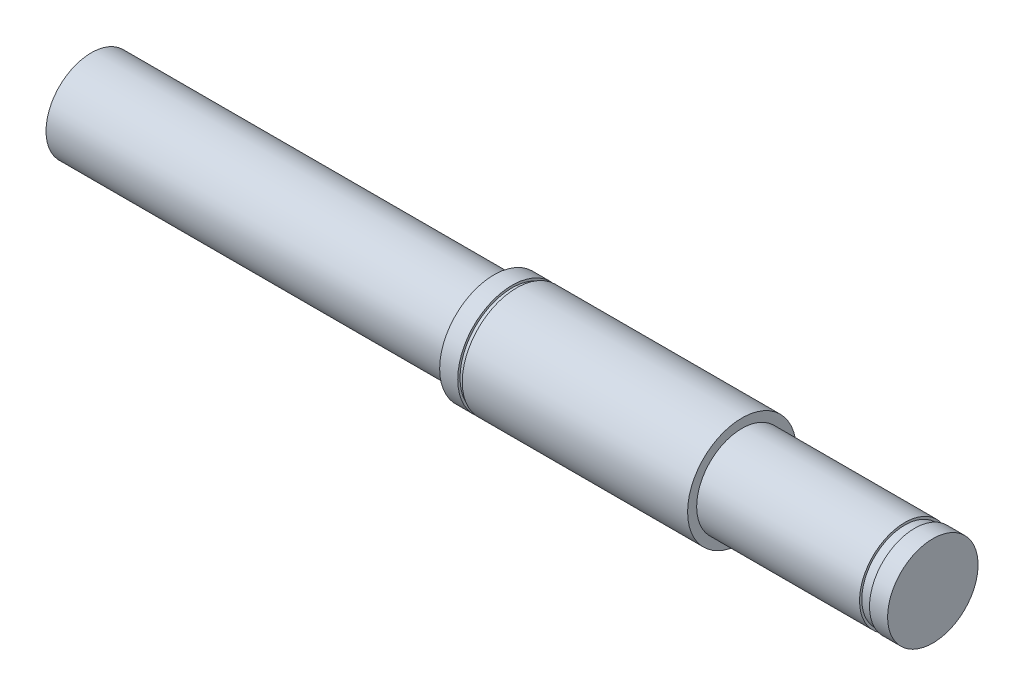
ISO-10303-21;
HEADER;
FILE_DESCRIPTION(('STEP AP214'),'2;1');
FILE_NAME('part.step','',(''),(''),'','','');
FILE_SCHEMA(('AUTOMOTIVE_DESIGN { 1 0 10303 214 1 1 1 1 }'));
ENDSEC;
DATA;
#1=APPLICATION_CONTEXT('core data for automotive mechanical design processes');
#2=APPLICATION_PROTOCOL_DEFINITION('international standard','automotive_design',2000,#1);
#3=PRODUCT_CONTEXT('',#1,'mechanical');
#4=PRODUCT('Part','Part','',(#3));
#5=PRODUCT_RELATED_PRODUCT_CATEGORY('part','',(#4));
#6=PRODUCT_DEFINITION_FORMATION('','',#4);
#7=PRODUCT_DEFINITION_CONTEXT('part definition',#1,'design');
#8=PRODUCT_DEFINITION('design','',#6,#7);
#9=PRODUCT_DEFINITION_SHAPE('','',#8);
#10=(LENGTH_UNIT() NAMED_UNIT(*) SI_UNIT(.MILLI.,.METRE.));
#11=(NAMED_UNIT(*) PLANE_ANGLE_UNIT() SI_UNIT($,.RADIAN.));
#12=(NAMED_UNIT(*) SI_UNIT($,.STERADIAN.) SOLID_ANGLE_UNIT());
#13=UNCERTAINTY_MEASURE_WITH_UNIT(LENGTH_MEASURE(1.E-05),#10,'distance_accuracy_value','');
#14=(GEOMETRIC_REPRESENTATION_CONTEXT(3) GLOBAL_UNCERTAINTY_ASSIGNED_CONTEXT((#13)) GLOBAL_UNIT_ASSIGNED_CONTEXT((#10,
#11,#12)) REPRESENTATION_CONTEXT('',''));
#15=CARTESIAN_POINT('',(0.,0.,0.));
#16=DIRECTION('',(0.,0.,1.));
#17=DIRECTION('',(1.,0.,0.));
#18=AXIS2_PLACEMENT_3D('',#15,#16,#17);
#19=CARTESIAN_POINT('',(44.5,4.75000000000001,0.));
#20=DIRECTION('',(1.,0.,0.));
#21=DIRECTION('',(0.,0.,-1.));
#22=AXIS2_PLACEMENT_3D('',#19,#20,#21);
#23=PLANE('',#22);
#24=CARTESIAN_POINT('',(44.5,0.,0.));
#25=DIRECTION('',(-1.,0.,0.));
#26=DIRECTION('',(0.,0.,1.));
#27=AXIS2_PLACEMENT_3D('',#24,#25,#26);
#28=CIRCLE('',#27,4.75000000000001);
#29=CARTESIAN_POINT('',(44.5,0.,4.75000000000001));
#30=VERTEX_POINT('',#29);
#31=EDGE_CURVE('E80',#30,#30,#28,.T.);
#32=ORIENTED_EDGE('',*,*,#31,.F.);
#33=EDGE_LOOP('',(#32));
#34=FACE_BOUND('',#33,.T.);
#35=CARTESIAN_POINT('',(44.5,0.,0.));
#36=DIRECTION('',(-1.,0.,0.));
#37=DIRECTION('',(0.,0.,1.));
#38=AXIS2_PLACEMENT_3D('',#35,#36,#37);
#39=CIRCLE('',#38,5.00000000000001);
#40=CARTESIAN_POINT('',(44.5,0.,5.00000000000001));
#41=VERTEX_POINT('',#40);
#42=EDGE_CURVE('E10',#41,#41,#39,.T.);
#43=ORIENTED_EDGE('',*,*,#42,.T.);
#44=EDGE_LOOP('',(#43));
#45=FACE_BOUND('',#44,.T.);
#46=ADVANCED_FACE('F34',(#34,#45),#23,.F.);
#47=CARTESIAN_POINT('',(0.,0.,0.));
#48=DIRECTION('',(-1.,0.,0.));
#49=DIRECTION('',(0.,0.,1.));
#50=AXIS2_PLACEMENT_3D('',#47,#48,#49);
#51=CYLINDRICAL_SURFACE('',#50,5.00000000000001);
#52=ORIENTED_EDGE('',*,*,#42,.F.);
#53=EDGE_LOOP('',(#52));
#54=FACE_BOUND('',#53,.T.);
#55=CARTESIAN_POINT('',(46.5,0.,0.));
#56=DIRECTION('',(-1.,0.,0.));
#57=DIRECTION('',(0.,0.,1.));
#58=AXIS2_PLACEMENT_3D('',#55,#56,#57);
#59=CIRCLE('',#58,5.00000000000001);
#60=CARTESIAN_POINT('',(46.5,0.,5.00000000000001));
#61=VERTEX_POINT('',#60);
#62=EDGE_CURVE('E40',#61,#61,#59,.T.);
#63=ORIENTED_EDGE('',*,*,#62,.T.);
#64=EDGE_LOOP('',(#63));
#65=FACE_BOUND('',#64,.T.);
#66=ADVANCED_FACE('F87',(#54,#65),#51,.T.);
#67=CARTESIAN_POINT('',(46.5000000000022,5.00000000000001,0.));
#68=DIRECTION('',(-1.,0.,0.));
#69=DIRECTION('',(0.,0.,1.));
#70=AXIS2_PLACEMENT_3D('',#67,#68,#69);
#71=PLANE('',#70);
#72=ORIENTED_EDGE('',*,*,#62,.F.);
#73=EDGE_LOOP('',(#72));
#74=FACE_BOUND('',#73,.T.);
#75=ADVANCED_FACE('F91',(#74),#71,.F.);
#76=CARTESIAN_POINT('',(-46.5,5.,0.));
#77=DIRECTION('',(1.,0.,0.));
#78=DIRECTION('',(0.,0.,-1.));
#79=AXIS2_PLACEMENT_3D('',#76,#77,#78);
#80=PLANE('',#79);
#81=CARTESIAN_POINT('',(-46.5,0.,0.));
#82=DIRECTION('',(-1.,0.,0.));
#83=DIRECTION('',(0.,0.,1.));
#84=AXIS2_PLACEMENT_3D('',#81,#82,#83);
#85=CIRCLE('',#84,5.);
#86=CARTESIAN_POINT('',(-46.5,0.,5.));
#87=VERTEX_POINT('',#86);
#88=EDGE_CURVE('E44',#87,#87,#85,.T.);
#89=ORIENTED_EDGE('',*,*,#88,.T.);
#90=EDGE_LOOP('',(#89));
#91=FACE_BOUND('',#90,.T.);
#92=ADVANCED_FACE('F96',(#91),#80,.F.);
#93=CARTESIAN_POINT('',(0.,0.,0.));
#94=DIRECTION('',(-1.,0.,0.));
#95=DIRECTION('',(0.,0.,1.));
#96=AXIS2_PLACEMENT_3D('',#93,#94,#95);
#97=CYLINDRICAL_SURFACE('',#96,5.00000000000001);
#98=ORIENTED_EDGE('',*,*,#88,.F.);
#99=EDGE_LOOP('',(#98));
#100=FACE_BOUND('',#99,.T.);
#101=CARTESIAN_POINT('',(-2.,0.,0.));
#102=DIRECTION('',(-1.,0.,0.));
#103=DIRECTION('',(0.,0.,1.));
#104=AXIS2_PLACEMENT_3D('',#101,#102,#103);
#105=CIRCLE('',#104,5.00000000000001);
#106=CARTESIAN_POINT('',(-2.,0.,5.00000000000001));
#107=VERTEX_POINT('',#106);
#108=EDGE_CURVE('E48',#107,#107,#105,.T.);
#109=ORIENTED_EDGE('',*,*,#108,.T.);
#110=EDGE_LOOP('',(#109));
#111=FACE_BOUND('',#110,.T.);
#112=ADVANCED_FACE('F102',(#100,#111),#97,.T.);
#113=CARTESIAN_POINT('',(-2.,5.00000000000001,0.));
#114=DIRECTION('',(1.,0.,0.));
#115=DIRECTION('',(0.,0.,-1.));
#116=AXIS2_PLACEMENT_3D('',#113,#114,#115);
#117=PLANE('',#116);
#118=ORIENTED_EDGE('',*,*,#108,.F.);
#119=EDGE_LOOP('',(#118));
#120=FACE_BOUND('',#119,.T.);
#121=CARTESIAN_POINT('',(-2.,0.,0.));
#122=DIRECTION('',(-1.,0.,0.));
#123=DIRECTION('',(0.,0.,1.));
#124=AXIS2_PLACEMENT_3D('',#121,#122,#123);
#125=CIRCLE('',#124,6.00000000000001);
#126=CARTESIAN_POINT('',(-2.,0.,6.00000000000001));
#127=VERTEX_POINT('',#126);
#128=EDGE_CURVE('E53',#127,#127,#125,.T.);
#129=ORIENTED_EDGE('',*,*,#128,.T.);
#130=EDGE_LOOP('',(#129));
#131=FACE_BOUND('',#130,.T.);
#132=ADVANCED_FACE('F106',(#120,#131),#117,.F.);
#133=CARTESIAN_POINT('',(0.,0.,0.));
#134=DIRECTION('',(-1.,0.,0.));
#135=DIRECTION('',(0.,0.,1.));
#136=AXIS2_PLACEMENT_3D('',#133,#134,#135);
#137=CYLINDRICAL_SURFACE('',#136,6.00000000000001);
#138=ORIENTED_EDGE('',*,*,#128,.F.);
#139=EDGE_LOOP('',(#138));
#140=FACE_BOUND('',#139,.T.);
#141=CARTESIAN_POINT('',(0.,0.,0.));
#142=DIRECTION('',(-1.,0.,0.));
#143=DIRECTION('',(0.,0.,1.));
#144=AXIS2_PLACEMENT_3D('',#141,#142,#143);
#145=CIRCLE('',#144,6.00000000000001);
#146=CARTESIAN_POINT('',(0.,0.,6.00000000000001));
#147=VERTEX_POINT('',#146);
#148=EDGE_CURVE('E56',#147,#147,#145,.T.);
#149=ORIENTED_EDGE('',*,*,#148,.T.);
#150=EDGE_LOOP('',(#149));
#151=FACE_BOUND('',#150,.T.);
#152=ADVANCED_FACE('F110',(#140,#151),#137,.T.);
#153=CARTESIAN_POINT('',(0.,6.00000000000001,0.));
#154=DIRECTION('',(-1.,0.,0.));
#155=DIRECTION('',(0.,0.,1.));
#156=AXIS2_PLACEMENT_3D('',#153,#154,#155);
#157=PLANE('',#156);
#158=ORIENTED_EDGE('',*,*,#148,.F.);
#159=EDGE_LOOP('',(#158));
#160=FACE_BOUND('',#159,.T.);
#161=CARTESIAN_POINT('',(0.,0.,0.));
#162=DIRECTION('',(-1.,0.,0.));
#163=DIRECTION('',(0.,0.,1.));
#164=AXIS2_PLACEMENT_3D('',#161,#162,#163);
#165=CIRCLE('',#164,5.74955641198013);
#166=CARTESIAN_POINT('',(0.,0.,5.74955641198013));
#167=VERTEX_POINT('',#166);
#168=EDGE_CURVE('E59',#167,#167,#165,.T.);
#169=ORIENTED_EDGE('',*,*,#168,.T.);
#170=EDGE_LOOP('',(#169));
#171=FACE_BOUND('',#170,.T.);
#172=ADVANCED_FACE('F114',(#160,#171),#157,.F.);
#173=CARTESIAN_POINT('',(0.,0.,0.));
#174=DIRECTION('',(-1.,0.,0.));
#175=DIRECTION('',(0.,0.,1.));
#176=AXIS2_PLACEMENT_3D('',#173,#174,#175);
#177=CYLINDRICAL_SURFACE('',#176,5.74955641198013);
#178=ORIENTED_EDGE('',*,*,#168,.F.);
#179=EDGE_LOOP('',(#178));
#180=FACE_BOUND('',#179,.T.);
#181=CARTESIAN_POINT('',(0.5,0.,0.));
#182=DIRECTION('',(-1.,0.,0.));
#183=DIRECTION('',(0.,0.,1.));
#184=AXIS2_PLACEMENT_3D('',#181,#182,#183);
#185=CIRCLE('',#184,5.74955641198013);
#186=CARTESIAN_POINT('',(0.5,0.,5.74955641198013));
#187=VERTEX_POINT('',#186);
#188=EDGE_CURVE('E62',#187,#187,#185,.T.);
#189=ORIENTED_EDGE('',*,*,#188,.T.);
#190=EDGE_LOOP('',(#189));
#191=FACE_BOUND('',#190,.T.);
#192=ADVANCED_FACE('F118',(#180,#191),#177,.T.);
#193=CARTESIAN_POINT('',(0.5,5.74955641198013,0.));
#194=DIRECTION('',(1.,0.,0.));
#195=DIRECTION('',(0.,0.,-1.));
#196=AXIS2_PLACEMENT_3D('',#193,#194,#195);
#197=PLANE('',#196);
#198=ORIENTED_EDGE('',*,*,#188,.F.);
#199=EDGE_LOOP('',(#198));
#200=FACE_BOUND('',#199,.T.);
#201=CARTESIAN_POINT('',(0.5,0.,0.));
#202=DIRECTION('',(-1.,0.,0.));
#203=DIRECTION('',(0.,0.,1.));
#204=AXIS2_PLACEMENT_3D('',#201,#202,#203);
#205=CIRCLE('',#204,6.00000000000001);
#206=CARTESIAN_POINT('',(0.5,0.,6.00000000000001));
#207=VERTEX_POINT('',#206);
#208=EDGE_CURVE('E65',#207,#207,#205,.T.);
#209=ORIENTED_EDGE('',*,*,#208,.T.);
#210=EDGE_LOOP('',(#209));
#211=FACE_BOUND('',#210,.T.);
#212=ADVANCED_FACE('F122',(#200,#211),#197,.F.);
#213=CARTESIAN_POINT('',(0.,0.,0.));
#214=DIRECTION('',(-1.,0.,0.));
#215=DIRECTION('',(0.,0.,1.));
#216=AXIS2_PLACEMENT_3D('',#213,#214,#215);
#217=CYLINDRICAL_SURFACE('',#216,6.00000000000001);
#218=ORIENTED_EDGE('',*,*,#208,.F.);
#219=EDGE_LOOP('',(#218));
#220=FACE_BOUND('',#219,.T.);
#221=CARTESIAN_POINT('',(25.4,0.,0.));
#222=DIRECTION('',(-1.,0.,0.));
#223=DIRECTION('',(0.,0.,1.));
#224=AXIS2_PLACEMENT_3D('',#221,#222,#223);
#225=CIRCLE('',#224,6.00000000000001);
#226=CARTESIAN_POINT('',(25.4,0.,6.00000000000001));
#227=VERTEX_POINT('',#226);
#228=EDGE_CURVE('E68',#227,#227,#225,.T.);
#229=ORIENTED_EDGE('',*,*,#228,.T.);
#230=EDGE_LOOP('',(#229));
#231=FACE_BOUND('',#230,.T.);
#232=ADVANCED_FACE('F126',(#220,#231),#217,.T.);
#233=CARTESIAN_POINT('',(25.4,6.00000000000001,0.));
#234=DIRECTION('',(-1.,0.,0.));
#235=DIRECTION('',(0.,0.,1.));
#236=AXIS2_PLACEMENT_3D('',#233,#234,#235);
#237=PLANE('',#236);
#238=ORIENTED_EDGE('',*,*,#228,.F.);
#239=EDGE_LOOP('',(#238));
#240=FACE_BOUND('',#239,.T.);
#241=CARTESIAN_POINT('',(25.4,0.,0.));
#242=DIRECTION('',(-1.,0.,0.));
#243=DIRECTION('',(0.,0.,1.));
#244=AXIS2_PLACEMENT_3D('',#241,#242,#243);
#245=CIRCLE('',#244,5.00000000000001);
#246=CARTESIAN_POINT('',(25.4,0.,5.00000000000001));
#247=VERTEX_POINT('',#246);
#248=EDGE_CURVE('E71',#247,#247,#245,.T.);
#249=ORIENTED_EDGE('',*,*,#248,.T.);
#250=EDGE_LOOP('',(#249));
#251=FACE_BOUND('',#250,.T.);
#252=ADVANCED_FACE('F130',(#240,#251),#237,.F.);
#253=CARTESIAN_POINT('',(0.,0.,0.));
#254=DIRECTION('',(-1.,0.,0.));
#255=DIRECTION('',(0.,0.,1.));
#256=AXIS2_PLACEMENT_3D('',#253,#254,#255);
#257=CYLINDRICAL_SURFACE('',#256,5.00000000000001);
#258=ORIENTED_EDGE('',*,*,#248,.F.);
#259=EDGE_LOOP('',(#258));
#260=FACE_BOUND('',#259,.T.);
#261=CARTESIAN_POINT('',(43.4,0.,0.));
#262=DIRECTION('',(-1.,0.,0.));
#263=DIRECTION('',(0.,0.,1.));
#264=AXIS2_PLACEMENT_3D('',#261,#262,#263);
#265=CIRCLE('',#264,5.00000000000001);
#266=CARTESIAN_POINT('',(43.4,0.,5.00000000000001));
#267=VERTEX_POINT('',#266);
#268=EDGE_CURVE('E74',#267,#267,#265,.T.);
#269=ORIENTED_EDGE('',*,*,#268,.T.);
#270=EDGE_LOOP('',(#269));
#271=FACE_BOUND('',#270,.T.);
#272=ADVANCED_FACE('F134',(#260,#271),#257,.T.);
#273=CARTESIAN_POINT('',(43.4,5.00000000000001,0.));
#274=DIRECTION('',(-1.,0.,0.));
#275=DIRECTION('',(0.,0.,1.));
#276=AXIS2_PLACEMENT_3D('',#273,#274,#275);
#277=PLANE('',#276);
#278=ORIENTED_EDGE('',*,*,#268,.F.);
#279=EDGE_LOOP('',(#278));
#280=FACE_BOUND('',#279,.T.);
#281=CARTESIAN_POINT('',(43.4,0.,0.));
#282=DIRECTION('',(-1.,0.,0.));
#283=DIRECTION('',(0.,0.,1.));
#284=AXIS2_PLACEMENT_3D('',#281,#282,#283);
#285=CIRCLE('',#284,4.75000000000001);
#286=CARTESIAN_POINT('',(43.4,0.,4.75000000000001));
#287=VERTEX_POINT('',#286);
#288=EDGE_CURVE('E77',#287,#287,#285,.T.);
#289=ORIENTED_EDGE('',*,*,#288,.T.);
#290=EDGE_LOOP('',(#289));
#291=FACE_BOUND('',#290,.T.);
#292=ADVANCED_FACE('F138',(#280,#291),#277,.F.);
#293=CARTESIAN_POINT('',(0.,0.,0.));
#294=DIRECTION('',(-1.,0.,0.));
#295=DIRECTION('',(0.,0.,1.));
#296=AXIS2_PLACEMENT_3D('',#293,#294,#295);
#297=CYLINDRICAL_SURFACE('',#296,4.75000000000001);
#298=ORIENTED_EDGE('',*,*,#288,.F.);
#299=EDGE_LOOP('',(#298));
#300=FACE_BOUND('',#299,.T.);
#301=ORIENTED_EDGE('',*,*,#31,.T.);
#302=EDGE_LOOP('',(#301));
#303=FACE_BOUND('',#302,.T.);
#304=ADVANCED_FACE('F84',(#300,#303),#297,.T.);
#305=CLOSED_SHELL('',(#46,#66,#75,#92,#112,#132,#152,#172,#192,#212,#232,#252,#272,#292,#304));
#306=MANIFOLD_SOLID_BREP('B2',#305);
#307=ADVANCED_BREP_SHAPE_REPRESENTATION('',(#18,#306),#14);
#308=SHAPE_DEFINITION_REPRESENTATION(#9,#307);
ENDSEC;
END-ISO-10303-21;
